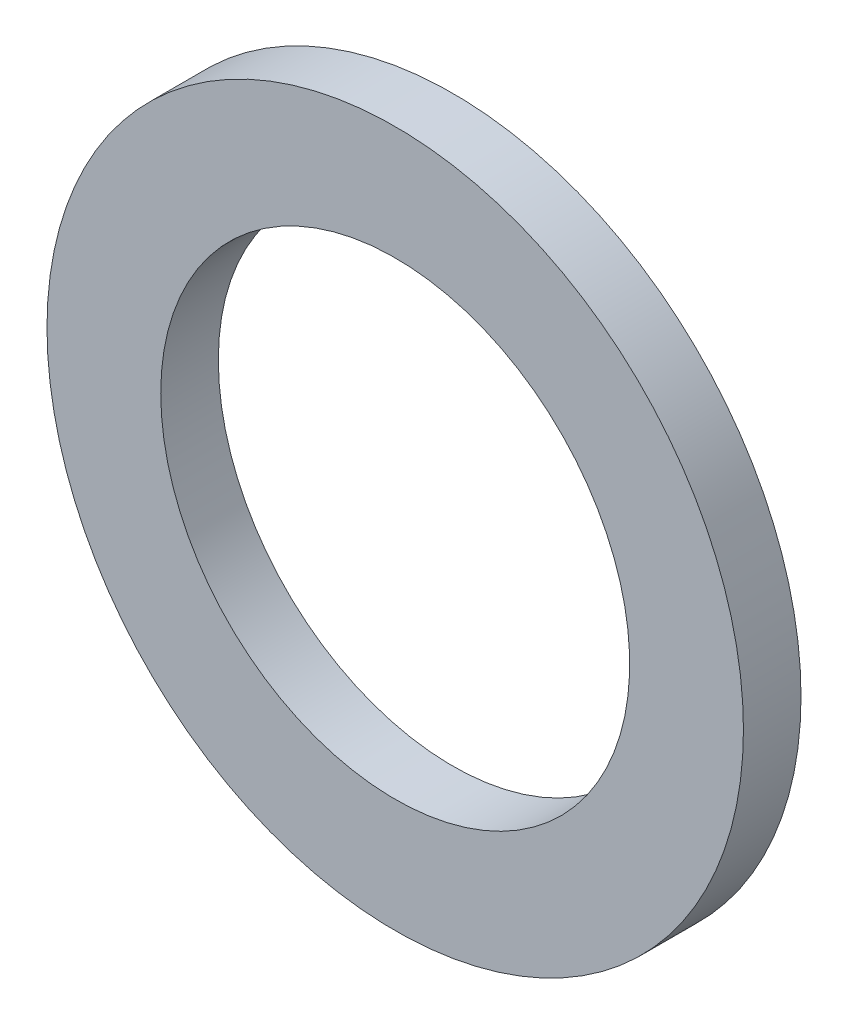
ISO-10303-21;
HEADER;
FILE_DESCRIPTION(('STEP AP214'),'2;1');
FILE_NAME('part.step','',(''),(''),'','','');
FILE_SCHEMA(('AUTOMOTIVE_DESIGN { 1 0 10303 214 1 1 1 1 }'));
ENDSEC;
DATA;
#1=APPLICATION_CONTEXT('core data for automotive mechanical design processes');
#2=APPLICATION_PROTOCOL_DEFINITION('international standard','automotive_design',2000,#1);
#3=PRODUCT_CONTEXT('',#1,'mechanical');
#4=PRODUCT('Part','Part','',(#3));
#5=PRODUCT_RELATED_PRODUCT_CATEGORY('part','',(#4));
#6=PRODUCT_DEFINITION_FORMATION('','',#4);
#7=PRODUCT_DEFINITION_CONTEXT('part definition',#1,'design');
#8=PRODUCT_DEFINITION('design','',#6,#7);
#9=PRODUCT_DEFINITION_SHAPE('','',#8);
#10=(LENGTH_UNIT() NAMED_UNIT(*) SI_UNIT(.MILLI.,.METRE.));
#11=(NAMED_UNIT(*) PLANE_ANGLE_UNIT() SI_UNIT($,.RADIAN.));
#12=(NAMED_UNIT(*) SI_UNIT($,.STERADIAN.) SOLID_ANGLE_UNIT());
#13=UNCERTAINTY_MEASURE_WITH_UNIT(LENGTH_MEASURE(1.E-05),#10,'distance_accuracy_value','');
#14=(GEOMETRIC_REPRESENTATION_CONTEXT(3) GLOBAL_UNCERTAINTY_ASSIGNED_CONTEXT((#13)) GLOBAL_UNIT_ASSIGNED_CONTEXT((#10,
#11,#12)) REPRESENTATION_CONTEXT('',''));
#15=CARTESIAN_POINT('',(0.,0.,0.));
#16=DIRECTION('',(0.,0.,1.));
#17=DIRECTION('',(1.,0.,0.));
#18=AXIS2_PLACEMENT_3D('',#15,#16,#17);
#19=CARTESIAN_POINT('',(0.,0.,0.));
#20=DIRECTION('',(0.,0.,-1.));
#21=DIRECTION('',(-1.,0.,0.));
#22=AXIS2_PLACEMENT_3D('',#19,#20,#21);
#23=PLANE('',#22);
#24=CARTESIAN_POINT('',(0.,0.,0.));
#25=DIRECTION('',(0.,0.,-1.));
#26=DIRECTION('',(-1.,0.,0.));
#27=AXIS2_PLACEMENT_3D('',#24,#25,#26);
#28=CIRCLE('',#27,9.525);
#29=CARTESIAN_POINT('',(-9.525,0.,0.));
#30=VERTEX_POINT('',#29);
#31=EDGE_CURVE('E27',#30,#30,#28,.F.);
#32=ORIENTED_EDGE('',*,*,#31,.F.);
#33=EDGE_LOOP('',(#32));
#34=FACE_BOUND('',#33,.T.);
#35=CARTESIAN_POINT('',(0.,0.,0.));
#36=DIRECTION('',(0.,0.,-1.));
#37=DIRECTION('',(-1.,0.,0.));
#38=AXIS2_PLACEMENT_3D('',#35,#36,#37);
#39=CIRCLE('',#38,6.4135);
#40=CARTESIAN_POINT('',(-6.4135,0.,0.));
#41=VERTEX_POINT('',#40);
#42=EDGE_CURVE('E18',#41,#41,#39,.F.);
#43=ORIENTED_EDGE('',*,*,#42,.T.);
#44=EDGE_LOOP('',(#43));
#45=FACE_BOUND('',#44,.T.);
#46=ADVANCED_FACE('F15',(#34,#45),#23,.T.);
#47=CARTESIAN_POINT('',(0.,0.,1.5748));
#48=DIRECTION('',(0.,0.,-1.));
#49=DIRECTION('',(-1.,0.,0.));
#50=AXIS2_PLACEMENT_3D('',#47,#48,#49);
#51=CYLINDRICAL_SURFACE('',#50,6.4135);
#52=ORIENTED_EDGE('',*,*,#42,.F.);
#53=EDGE_LOOP('',(#52));
#54=FACE_BOUND('',#53,.T.);
#55=CARTESIAN_POINT('',(0.,0.,1.5748));
#56=DIRECTION('',(0.,0.,-1.));
#57=DIRECTION('',(-1.,0.,0.));
#58=AXIS2_PLACEMENT_3D('',#55,#56,#57);
#59=CIRCLE('',#58,6.4135);
#60=CARTESIAN_POINT('',(-6.4135,0.,1.5748));
#61=VERTEX_POINT('',#60);
#62=EDGE_CURVE('E22',#61,#61,#59,.F.);
#63=ORIENTED_EDGE('',*,*,#62,.T.);
#64=EDGE_LOOP('',(#63));
#65=FACE_BOUND('',#64,.T.);
#66=ADVANCED_FACE('F36',(#54,#65),#51,.F.);
#67=CARTESIAN_POINT('',(0.,0.,1.5748));
#68=DIRECTION('',(0.,0.,-1.));
#69=DIRECTION('',(-1.,0.,0.));
#70=AXIS2_PLACEMENT_3D('',#67,#68,#69);
#71=CYLINDRICAL_SURFACE('',#70,9.525);
#72=ORIENTED_EDGE('',*,*,#31,.T.);
#73=EDGE_LOOP('',(#72));
#74=FACE_BOUND('',#73,.T.);
#75=CARTESIAN_POINT('',(0.,0.,1.5748));
#76=DIRECTION('',(0.,0.,-1.));
#77=DIRECTION('',(-1.,0.,0.));
#78=AXIS2_PLACEMENT_3D('',#75,#76,#77);
#79=CIRCLE('',#78,9.525);
#80=CARTESIAN_POINT('',(-9.525,0.,1.5748));
#81=VERTEX_POINT('',#80);
#82=EDGE_CURVE('E10',#81,#81,#79,.T.);
#83=ORIENTED_EDGE('',*,*,#82,.T.);
#84=EDGE_LOOP('',(#83));
#85=FACE_BOUND('',#84,.T.);
#86=ADVANCED_FACE('F39',(#74,#85),#71,.T.);
#87=CARTESIAN_POINT('',(0.,0.,1.5748));
#88=DIRECTION('',(0.,0.,-1.));
#89=DIRECTION('',(-1.,0.,0.));
#90=AXIS2_PLACEMENT_3D('',#87,#88,#89);
#91=PLANE('',#90);
#92=ORIENTED_EDGE('',*,*,#82,.F.);
#93=EDGE_LOOP('',(#92));
#94=FACE_BOUND('',#93,.T.);
#95=ORIENTED_EDGE('',*,*,#62,.F.);
#96=EDGE_LOOP('',(#95));
#97=FACE_BOUND('',#96,.T.);
#98=ADVANCED_FACE('F42',(#94,#97),#91,.F.);
#99=CLOSED_SHELL('',(#46,#66,#86,#98));
#100=MANIFOLD_SOLID_BREP('B1',#99);
#101=ADVANCED_BREP_SHAPE_REPRESENTATION('',(#18,#100),#14);
#102=SHAPE_DEFINITION_REPRESENTATION(#9,#101);
ENDSEC;
END-ISO-10303-21;
